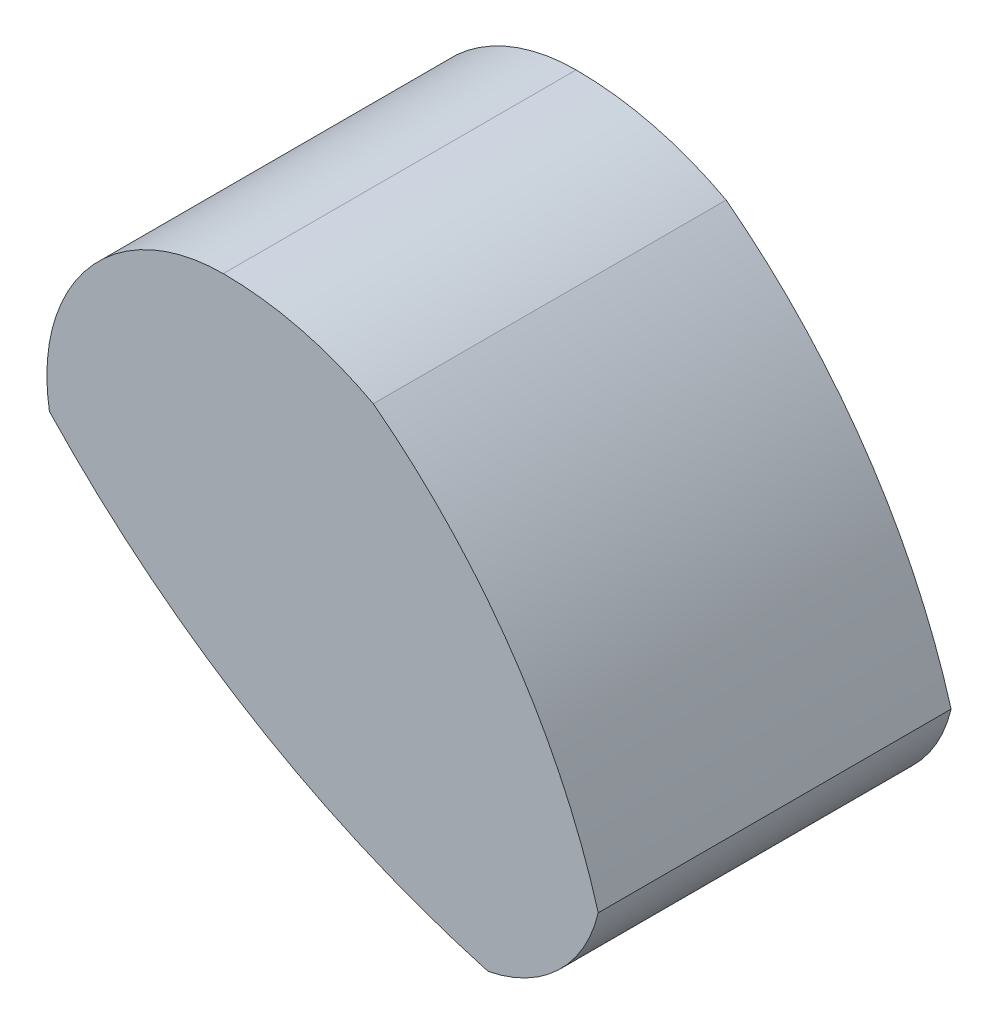
ISO-10303-21;
HEADER;
FILE_DESCRIPTION(('STEP AP214'),'2;1');
FILE_NAME('part.step','',(''),(''),'','','');
FILE_SCHEMA(('AUTOMOTIVE_DESIGN { 1 0 10303 214 1 1 1 1 }'));
ENDSEC;
DATA;
#1=APPLICATION_CONTEXT('core data for automotive mechanical design processes');
#2=APPLICATION_PROTOCOL_DEFINITION('international standard','automotive_design',2000,#1);
#3=PRODUCT_CONTEXT('',#1,'mechanical');
#4=PRODUCT('Part','Part','',(#3));
#5=PRODUCT_RELATED_PRODUCT_CATEGORY('part','',(#4));
#6=PRODUCT_DEFINITION_FORMATION('','',#4);
#7=PRODUCT_DEFINITION_CONTEXT('part definition',#1,'design');
#8=PRODUCT_DEFINITION('design','',#6,#7);
#9=PRODUCT_DEFINITION_SHAPE('','',#8);
#10=(LENGTH_UNIT() NAMED_UNIT(*) SI_UNIT(.MILLI.,.METRE.));
#11=(NAMED_UNIT(*) PLANE_ANGLE_UNIT() SI_UNIT($,.RADIAN.));
#12=(NAMED_UNIT(*) SI_UNIT($,.STERADIAN.) SOLID_ANGLE_UNIT());
#13=UNCERTAINTY_MEASURE_WITH_UNIT(LENGTH_MEASURE(1.E-05),#10,'distance_accuracy_value','');
#14=(GEOMETRIC_REPRESENTATION_CONTEXT(3) GLOBAL_UNCERTAINTY_ASSIGNED_CONTEXT((#13)) GLOBAL_UNIT_ASSIGNED_CONTEXT((#10,
#11,#12)) REPRESENTATION_CONTEXT('',''));
#15=CARTESIAN_POINT('',(0.,0.,0.));
#16=DIRECTION('',(0.,0.,1.));
#17=DIRECTION('',(1.,0.,0.));
#18=AXIS2_PLACEMENT_3D('',#15,#16,#17);
#19=CARTESIAN_POINT('',(14.7558361628614,17.6339188873717,10.));
#20=DIRECTION('',(0.,0.,-1.));
#21=DIRECTION('',(-1.,0.,0.));
#22=AXIS2_PLACEMENT_3D('',#19,#20,#21);
#23=CYLINDRICAL_SURFACE('',#22,27.);
#24=CARTESIAN_POINT('',(14.7558361628614,17.6339188873717,0.));
#25=DIRECTION('',(0.,0.,1.));
#26=DIRECTION('',(1.,0.,0.));
#27=AXIS2_PLACEMENT_3D('',#24,#25,#26);
#28=CIRCLE('',#27,27.);
#29=CARTESIAN_POINT('',(-4.92766522488857,-0.847416917121552,0.));
#30=VERTEX_POINT('',#29);
#31=CARTESIAN_POINT('',(7.5045969424804,-8.37414774144188,0.));
#32=VERTEX_POINT('',#31);
#33=EDGE_CURVE('E124',#30,#32,#28,.T.);
#34=ORIENTED_EDGE('',*,*,#33,.T.);
#35=DIRECTION('',(0.,0.,-1.));
#36=VECTOR('',#35,1.);
#37=CARTESIAN_POINT('',(7.5045969424804,-8.37414774144188,10.));
#38=LINE('',#37,#36);
#39=CARTESIAN_POINT('',(7.5045969424804,-8.37414774144188,10.));
#40=VERTEX_POINT('',#39);
#41=EDGE_CURVE('E11',#40,#32,#38,.T.);
#42=ORIENTED_EDGE('',*,*,#41,.F.);
#43=CARTESIAN_POINT('',(14.7558361628614,17.6339188873717,10.));
#44=DIRECTION('',(0.,0.,1.));
#45=DIRECTION('',(1.,0.,0.));
#46=AXIS2_PLACEMENT_3D('',#43,#44,#45);
#47=CIRCLE('',#46,27.);
#48=CARTESIAN_POINT('',(-4.92766522488857,-0.847416917121552,10.));
#49=VERTEX_POINT('',#48);
#50=EDGE_CURVE('E133',#49,#40,#47,.T.);
#51=ORIENTED_EDGE('',*,*,#50,.F.);
#52=DIRECTION('',(0.,0.,-1.));
#53=VECTOR('',#52,1.);
#54=CARTESIAN_POINT('',(-4.92766522488857,-0.847416917121552,10.));
#55=LINE('',#54,#53);
#56=EDGE_CURVE('E120',#49,#30,#55,.T.);
#57=ORIENTED_EDGE('',*,*,#56,.T.);
#58=EDGE_LOOP('',(#34,#42,#51,#57));
#59=FACE_BOUND('',#58,.T.);
#60=ADVANCED_FACE('F48',(#59),#23,.T.);
#61=CARTESIAN_POINT('',(6.73617889394571,-4.44864984911203,10.));
#62=DIRECTION('',(0.,0.,-1.));
#63=DIRECTION('',(-1.,0.,0.));
#64=AXIS2_PLACEMENT_3D('',#61,#62,#63);
#65=CYLINDRICAL_SURFACE('',#64,4.);
#66=CARTESIAN_POINT('',(6.73617889394571,-4.44864984911203,0.));
#67=DIRECTION('',(0.,0.,1.));
#68=DIRECTION('',(1.,0.,0.));
#69=AXIS2_PLACEMENT_3D('',#66,#67,#68);
#70=CIRCLE('',#69,4.);
#71=CARTESIAN_POINT('',(10.6276379585246,-5.37414774144189,0.));
#72=VERTEX_POINT('',#71);
#73=EDGE_CURVE('E127',#32,#72,#70,.T.);
#74=ORIENTED_EDGE('',*,*,#73,.T.);
#75=DIRECTION('',(0.,0.,-1.));
#76=VECTOR('',#75,1.);
#77=CARTESIAN_POINT('',(10.6276379585246,-5.37414774144189,10.));
#78=LINE('',#77,#76);
#79=CARTESIAN_POINT('',(10.6276379585246,-5.37414774144189,10.));
#80=VERTEX_POINT('',#79);
#81=EDGE_CURVE('E56',#80,#72,#78,.T.);
#82=ORIENTED_EDGE('',*,*,#81,.F.);
#83=CARTESIAN_POINT('',(6.73617889394571,-4.44864984911203,10.));
#84=DIRECTION('',(0.,0.,1.));
#85=DIRECTION('',(1.,0.,0.));
#86=AXIS2_PLACEMENT_3D('',#83,#84,#85);
#87=CIRCLE('',#86,4.);
#88=EDGE_CURVE('E99',#40,#80,#87,.T.);
#89=ORIENTED_EDGE('',*,*,#88,.F.);
#90=ORIENTED_EDGE('',*,*,#41,.T.);
#91=EDGE_LOOP('',(#74,#82,#89,#90));
#92=FACE_BOUND('',#91,.T.);
#93=ADVANCED_FACE('F153',(#92),#65,.T.);
#94=CARTESIAN_POINT('',(-6.66176505919359,-10.3817962206103,10.));
#95=DIRECTION('',(0.,0.,-1.));
#96=DIRECTION('',(-1.,0.,0.));
#97=AXIS2_PLACEMENT_3D('',#94,#95,#96);
#98=CYLINDRICAL_SURFACE('',#97,18.);
#99=CARTESIAN_POINT('',(-6.66176505919359,-10.3817962206103,0.));
#100=DIRECTION('',(0.,0.,1.));
#101=DIRECTION('',(1.,0.,0.));
#102=AXIS2_PLACEMENT_3D('',#99,#100,#101);
#103=CIRCLE('',#102,18.);
#104=CARTESIAN_POINT('',(4.2516887972733,3.93241088012594,0.));
#105=VERTEX_POINT('',#104);
#106=EDGE_CURVE('E115',#72,#105,#103,.T.);
#107=ORIENTED_EDGE('',*,*,#106,.T.);
#108=DIRECTION('',(0.,0.,-1.));
#109=VECTOR('',#108,1.);
#110=CARTESIAN_POINT('',(4.2516887972733,3.93241088012594,10.));
#111=LINE('',#110,#109);
#112=CARTESIAN_POINT('',(4.2516887972733,3.93241088012594,10.));
#113=VERTEX_POINT('',#112);
#114=EDGE_CURVE('E112',#113,#105,#111,.T.);
#115=ORIENTED_EDGE('',*,*,#114,.F.);
#116=CARTESIAN_POINT('',(-6.66176505919359,-10.3817962206103,10.));
#117=DIRECTION('',(0.,0.,1.));
#118=DIRECTION('',(1.,0.,0.));
#119=AXIS2_PLACEMENT_3D('',#116,#117,#118);
#120=CIRCLE('',#119,18.);
#121=EDGE_CURVE('E104',#80,#113,#120,.T.);
#122=ORIENTED_EDGE('',*,*,#121,.F.);
#123=ORIENTED_EDGE('',*,*,#81,.T.);
#124=EDGE_LOOP('',(#107,#115,#122,#123));
#125=FACE_BOUND('',#124,.T.);
#126=ADVANCED_FACE('F113',(#125),#98,.T.);
#127=CARTESIAN_POINT('',(0.,-4.,10.));
#128=DIRECTION('',(0.,0.,-1.));
#129=DIRECTION('',(-1.,0.,0.));
#130=AXIS2_PLACEMENT_3D('',#127,#128,#129);
#131=CYLINDRICAL_SURFACE('',#130,8.99999999999999);
#132=CARTESIAN_POINT('',(0.,-4.,0.));
#133=DIRECTION('',(0.,0.,1.));
#134=DIRECTION('',(1.,0.,0.));
#135=AXIS2_PLACEMENT_3D('',#132,#133,#134);
#136=CIRCLE('',#135,8.99999999999999);
#137=CARTESIAN_POINT('',(0.,4.99999999999999,0.));
#138=VERTEX_POINT('',#137);
#139=EDGE_CURVE('E85',#105,#138,#136,.T.);
#140=ORIENTED_EDGE('',*,*,#139,.T.);
#141=DIRECTION('',(0.,0.,-1.));
#142=VECTOR('',#141,1.);
#143=CARTESIAN_POINT('',(0.,4.99999999999999,10.));
#144=LINE('',#143,#142);
#145=CARTESIAN_POINT('',(0.,4.99999999999999,10.));
#146=VERTEX_POINT('',#145);
#147=EDGE_CURVE('E116',#146,#138,#144,.T.);
#148=ORIENTED_EDGE('',*,*,#147,.F.);
#149=CARTESIAN_POINT('',(0.,-4.,10.));
#150=DIRECTION('',(0.,0.,1.));
#151=DIRECTION('',(1.,0.,0.));
#152=AXIS2_PLACEMENT_3D('',#149,#150,#151);
#153=CIRCLE('',#152,8.99999999999999);
#154=EDGE_CURVE('E108',#113,#146,#153,.T.);
#155=ORIENTED_EDGE('',*,*,#154,.F.);
#156=ORIENTED_EDGE('',*,*,#114,.T.);
#157=EDGE_LOOP('',(#140,#148,#155,#156));
#158=FACE_BOUND('',#157,.T.);
#159=ADVANCED_FACE('F118',(#158),#131,.T.);
#160=CARTESIAN_POINT('',(0.,0.,10.));
#161=DIRECTION('',(0.,0.,-1.));
#162=DIRECTION('',(-1.,0.,0.));
#163=AXIS2_PLACEMENT_3D('',#160,#161,#162);
#164=CYLINDRICAL_SURFACE('',#163,5.);
#165=CARTESIAN_POINT('',(0.,0.,0.));
#166=DIRECTION('',(0.,0.,1.));
#167=DIRECTION('',(1.,0.,0.));
#168=AXIS2_PLACEMENT_3D('',#165,#166,#167);
#169=CIRCLE('',#168,5.);
#170=EDGE_CURVE('E91',#138,#30,#169,.T.);
#171=ORIENTED_EDGE('',*,*,#170,.T.);
#172=ORIENTED_EDGE('',*,*,#56,.F.);
#173=CARTESIAN_POINT('',(0.,0.,10.));
#174=DIRECTION('',(0.,0.,1.));
#175=DIRECTION('',(1.,0.,0.));
#176=AXIS2_PLACEMENT_3D('',#173,#174,#175);
#177=CIRCLE('',#176,5.);
#178=EDGE_CURVE('E64',#146,#49,#177,.T.);
#179=ORIENTED_EDGE('',*,*,#178,.F.);
#180=ORIENTED_EDGE('',*,*,#147,.T.);
#181=EDGE_LOOP('',(#171,#172,#179,#180));
#182=FACE_BOUND('',#181,.T.);
#183=ADVANCED_FACE('F141',(#182),#164,.T.);
#184=CARTESIAN_POINT('',(0.,0.,10.));
#185=DIRECTION('',(0.,0.,1.));
#186=DIRECTION('',(1.,0.,0.));
#187=AXIS2_PLACEMENT_3D('',#184,#185,#186);
#188=PLANE('',#187);
#189=ORIENTED_EDGE('',*,*,#50,.T.);
#190=ORIENTED_EDGE('',*,*,#88,.T.);
#191=ORIENTED_EDGE('',*,*,#121,.T.);
#192=ORIENTED_EDGE('',*,*,#154,.T.);
#193=ORIENTED_EDGE('',*,*,#178,.T.);
#194=EDGE_LOOP('',(#189,#190,#191,#192,#193));
#195=FACE_BOUND('',#194,.T.);
#196=ADVANCED_FACE('F106',(#195),#188,.T.);
#197=CARTESIAN_POINT('',(0.,0.,0.));
#198=DIRECTION('',(0.,0.,1.));
#199=DIRECTION('',(1.,0.,0.));
#200=AXIS2_PLACEMENT_3D('',#197,#198,#199);
#201=PLANE('',#200);
#202=CARTESIAN_POINT('',(0.,2.,0.));
#203=DIRECTION('',(0.,0.,-1.));
#204=DIRECTION('',(-1.,0.,0.));
#205=AXIS2_PLACEMENT_3D('',#202,#203,#204);
#206=CIRCLE('',#205,1.8);
#207=CARTESIAN_POINT('',(-1.8,2.,0.));
#208=VERTEX_POINT('',#207);
#209=EDGE_CURVE('E224',#208,#208,#206,.T.);
#210=ORIENTED_EDGE('',*,*,#209,.F.);
#211=EDGE_LOOP('',(#210));
#212=FACE_BOUND('',#211,.T.);
#213=ORIENTED_EDGE('',*,*,#33,.F.);
#214=ORIENTED_EDGE('',*,*,#170,.F.);
#215=ORIENTED_EDGE('',*,*,#139,.F.);
#216=ORIENTED_EDGE('',*,*,#106,.F.);
#217=ORIENTED_EDGE('',*,*,#73,.F.);
#218=EDGE_LOOP('',(#213,#214,#215,#216,#217));
#219=FACE_BOUND('',#218,.T.);
#220=ADVANCED_FACE('F137',(#212,#219),#201,.F.);
#221=CARTESIAN_POINT('',(0.,2.,5.5));
#222=DIRECTION('',(0.,0.,-1.));
#223=DIRECTION('',(-1.,0.,0.));
#224=AXIS2_PLACEMENT_3D('',#221,#222,#223);
#225=CONICAL_SURFACE('',#224,1.8,1.02974425867665);
#226=CARTESIAN_POINT('',(0.,2.,6.58154911424961));
#227=VERTEX_POINT('',#226);
#228=VERTEX_LOOP('',#227);
#229=FACE_BOUND('',#228,.T.);
#230=CARTESIAN_POINT('',(0.,2.,5.5));
#231=DIRECTION('',(0.,0.,-1.));
#232=DIRECTION('',(-1.,0.,0.));
#233=AXIS2_PLACEMENT_3D('',#230,#231,#232);
#234=CIRCLE('',#233,1.8);
#235=CARTESIAN_POINT('',(-1.8,2.,5.5));
#236=VERTEX_POINT('',#235);
#237=EDGE_CURVE('E128',#236,#236,#234,.T.);
#238=ORIENTED_EDGE('',*,*,#237,.T.);
#239=EDGE_LOOP('',(#238));
#240=FACE_BOUND('',#239,.T.);
#241=ADVANCED_FACE('F180',(#229,#240),#225,.F.);
#242=CARTESIAN_POINT('',(0.,2.,0.));
#243=DIRECTION('',(0.,0.,-1.));
#244=DIRECTION('',(-1.,0.,0.));
#245=AXIS2_PLACEMENT_3D('',#242,#243,#244);
#246=CYLINDRICAL_SURFACE('',#245,1.8);
#247=ORIENTED_EDGE('',*,*,#237,.F.);
#248=EDGE_LOOP('',(#247));
#249=FACE_BOUND('',#248,.T.);
#250=ORIENTED_EDGE('',*,*,#209,.T.);
#251=EDGE_LOOP('',(#250));
#252=FACE_BOUND('',#251,.T.);
#253=ADVANCED_FACE('F187',(#249,#252),#246,.F.);
#254=CLOSED_SHELL('',(#60,#93,#126,#159,#183,#196,#220,#241,#253));
#255=MANIFOLD_SOLID_BREP('B2',#254);
#256=ADVANCED_BREP_SHAPE_REPRESENTATION('',(#18,#255),#14);
#257=SHAPE_DEFINITION_REPRESENTATION(#9,#256);
ENDSEC;
END-ISO-10303-21;
